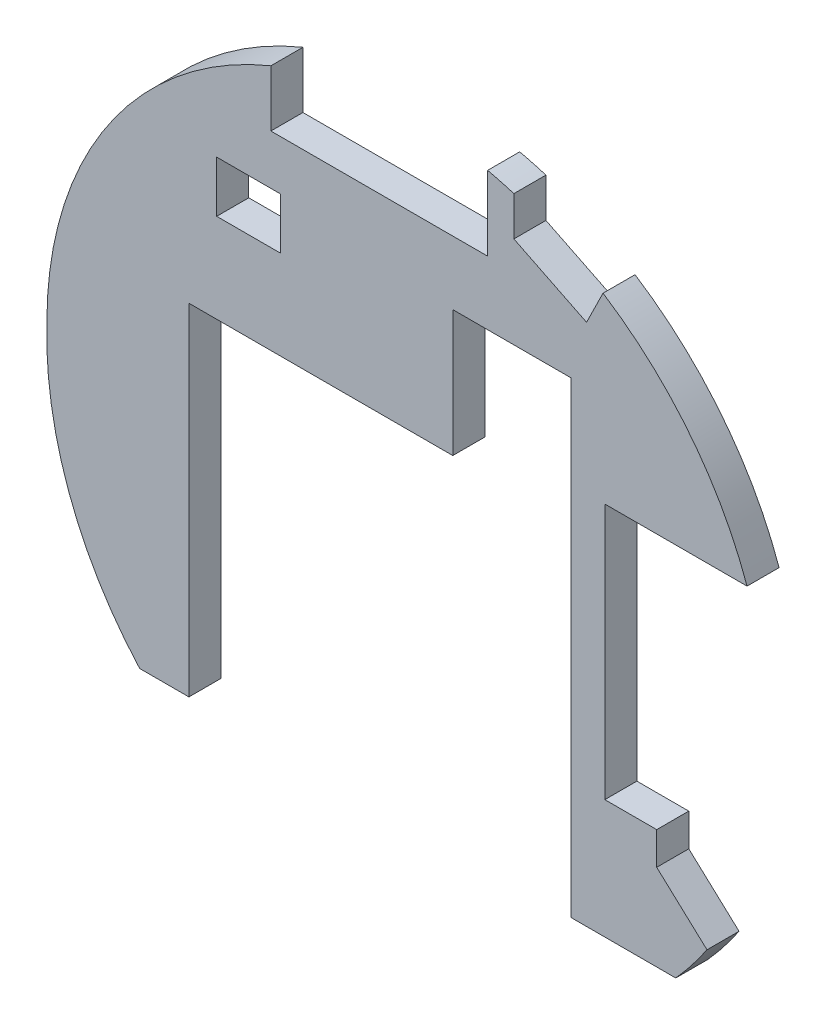
ISO-10303-21;
HEADER;
FILE_DESCRIPTION(('STEP AP214'),'2;1');
FILE_NAME('part.step','',(''),(''),'','','');
FILE_SCHEMA(('AUTOMOTIVE_DESIGN { 1 0 10303 214 1 1 1 1 }'));
ENDSEC;
DATA;
#1=APPLICATION_CONTEXT('core data for automotive mechanical design processes');
#2=APPLICATION_PROTOCOL_DEFINITION('international standard','automotive_design',2000,#1);
#3=PRODUCT_CONTEXT('',#1,'mechanical');
#4=PRODUCT('Part','Part','',(#3));
#5=PRODUCT_RELATED_PRODUCT_CATEGORY('part','',(#4));
#6=PRODUCT_DEFINITION_FORMATION('','',#4);
#7=PRODUCT_DEFINITION_CONTEXT('part definition',#1,'design');
#8=PRODUCT_DEFINITION('design','',#6,#7);
#9=PRODUCT_DEFINITION_SHAPE('','',#8);
#10=(LENGTH_UNIT() NAMED_UNIT(*) SI_UNIT(.MILLI.,.METRE.));
#11=(NAMED_UNIT(*) PLANE_ANGLE_UNIT() SI_UNIT($,.RADIAN.));
#12=(NAMED_UNIT(*) SI_UNIT($,.STERADIAN.) SOLID_ANGLE_UNIT());
#13=UNCERTAINTY_MEASURE_WITH_UNIT(LENGTH_MEASURE(1.E-05),#10,'distance_accuracy_value','');
#14=(GEOMETRIC_REPRESENTATION_CONTEXT(3) GLOBAL_UNCERTAINTY_ASSIGNED_CONTEXT((#13)) GLOBAL_UNIT_ASSIGNED_CONTEXT((#10,
#11,#12)) REPRESENTATION_CONTEXT('',''));
#15=CARTESIAN_POINT('',(0.,0.,0.));
#16=DIRECTION('',(0.,0.,1.));
#17=DIRECTION('',(1.,0.,0.));
#18=AXIS2_PLACEMENT_3D('',#15,#16,#17);
#19=CARTESIAN_POINT('',(-30.8292528479007,-0.03,-1.6));
#20=DIRECTION('',(0.,0.,1.));
#21=DIRECTION('',(1.,0.,0.));
#22=AXIS2_PLACEMENT_3D('',#19,#20,#21);
#23=PLANE('',#22);
#24=DIRECTION('',(0.,-1.,0.));
#25=VECTOR('',#24,1.);
#26=CARTESIAN_POINT('',(-18.815,22.72,-1.6));
#27=LINE('',#26,#25);
#28=CARTESIAN_POINT('',(-18.815,24.,-1.6));
#29=VERTEX_POINT('',#28);
#30=CARTESIAN_POINT('',(-18.815,21.44,-1.6));
#31=VERTEX_POINT('',#30);
#32=EDGE_CURVE('E439',#29,#31,#27,.T.);
#33=ORIENTED_EDGE('',*,*,#32,.F.);
#34=DIRECTION('',(1.,0.,0.));
#35=VECTOR('',#34,1.);
#36=CARTESIAN_POINT('',(-20.405,24.,-1.6));
#37=LINE('',#36,#35);
#38=CARTESIAN_POINT('',(-21.995,24.,-1.6));
#39=VERTEX_POINT('',#38);
#40=EDGE_CURVE('E444',#39,#29,#37,.T.);
#41=ORIENTED_EDGE('',*,*,#40,.F.);
#42=DIRECTION('',(0.,1.,0.));
#43=VECTOR('',#42,1.);
#44=CARTESIAN_POINT('',(-21.995,22.72,-1.6));
#45=LINE('',#44,#43);
#46=CARTESIAN_POINT('',(-21.995,21.44,-1.6));
#47=VERTEX_POINT('',#46);
#48=EDGE_CURVE('E449',#47,#39,#45,.T.);
#49=ORIENTED_EDGE('',*,*,#48,.F.);
#50=DIRECTION('',(-1.,0.,0.));
#51=VECTOR('',#50,1.);
#52=CARTESIAN_POINT('',(-20.405,21.44,-1.6));
#53=LINE('',#52,#51);
#54=EDGE_CURVE('E435',#31,#47,#53,.T.);
#55=ORIENTED_EDGE('',*,*,#54,.F.);
#56=EDGE_LOOP('',(#33,#41,#49,#55));
#57=FACE_BOUND('',#56,.T.);
#58=DIRECTION('',(0.,1.,0.));
#59=VECTOR('',#58,1.);
#60=CARTESIAN_POINT('',(-10.21,20.145,-1.6));
#61=LINE('',#60,#59);
#62=CARTESIAN_POINT('',(-10.21,16.99,-1.6));
#63=VERTEX_POINT('',#62);
#64=CARTESIAN_POINT('',(-10.21,23.3,-1.6));
#65=VERTEX_POINT('',#64);
#66=EDGE_CURVE('E243',#63,#65,#61,.T.);
#67=ORIENTED_EDGE('',*,*,#66,.F.);
#68=DIRECTION('',(1.,0.,0.));
#69=VECTOR('',#68,1.);
#70=CARTESIAN_POINT('',(-16.795,16.99,-1.6));
#71=LINE('',#70,#69);
#72=CARTESIAN_POINT('',(-23.38,16.99,-1.6));
#73=VERTEX_POINT('',#72);
#74=EDGE_CURVE('E332',#73,#63,#71,.T.);
#75=ORIENTED_EDGE('',*,*,#74,.F.);
#76=DIRECTION('',(1.63924794340962E-05,0.999999999865643,0.));
#77=VECTOR('',#76,1.);
#78=CARTESIAN_POINT('',(-23.3801395,8.48,-1.6));
#79=LINE('',#78,#77);
#80=CARTESIAN_POINT('',(-23.380279,-0.0300000000000002,-1.6));
#81=VERTEX_POINT('',#80);
#82=EDGE_CURVE('E267',#81,#73,#79,.T.);
#83=ORIENTED_EDGE('',*,*,#82,.F.);
#84=DIRECTION('',(1.,0.,0.));
#85=VECTOR('',#84,1.);
#86=CARTESIAN_POINT('',(-24.6101395,-0.03,-1.6));
#87=LINE('',#86,#85);
#88=CARTESIAN_POINT('',(-25.8399999999612,-0.0300000000000003,-1.6));
#89=VERTEX_POINT('',#88);
#90=EDGE_CURVE('E261',#89,#81,#87,.T.);
#91=ORIENTED_EDGE('',*,*,#90,.F.);
#92=CARTESIAN_POINT('',(-12.4345083212483,12.0497416317025,-1.6));
#93=DIRECTION('',(0.,0.,1.));
#94=DIRECTION('',(1.,0.,0.));
#95=AXIS2_PLACEMENT_3D('',#92,#93,#94);
#96=CIRCLE('',#95,18.045147963807);
#97=CARTESIAN_POINT('',(-30.4699999999998,12.640000000014,-1.6));
#98=VERTEX_POINT('',#97);
#99=EDGE_CURVE('E366',#98,#89,#96,.T.);
#100=ORIENTED_EDGE('',*,*,#99,.F.);
#101=CARTESIAN_POINT('',(-12.4797937548539,12.648613095999,-1.6));
#102=DIRECTION('',(0.,0.,1.));
#103=DIRECTION('',(1.,0.,0.));
#104=AXIS2_PLACEMENT_3D('',#101,#102,#103);
#105=CIRCLE('',#104,17.9902083069736);
#106=CARTESIAN_POINT('',(-19.29,29.3000000000041,-1.6));
#107=VERTEX_POINT('',#106);
#108=EDGE_CURVE('E369',#107,#98,#105,.T.);
#109=ORIENTED_EDGE('',*,*,#108,.F.);
#110=DIRECTION('',(0.,1.,0.));
#111=VECTOR('',#110,1.);
#112=CARTESIAN_POINT('',(-19.29,27.89,-1.6));
#113=LINE('',#112,#111);
#114=CARTESIAN_POINT('',(-19.29,26.48,-1.6));
#115=VERTEX_POINT('',#114);
#116=EDGE_CURVE('E272',#115,#107,#113,.T.);
#117=ORIENTED_EDGE('',*,*,#116,.F.);
#118=DIRECTION('',(1.,0.,0.));
#119=VECTOR('',#118,1.);
#120=CARTESIAN_POINT('',(-13.88,26.48,-1.6));
#121=LINE('',#120,#119);
#122=CARTESIAN_POINT('',(-8.47,26.48,-1.6));
#123=VERTEX_POINT('',#122);
#124=EDGE_CURVE('E278',#115,#123,#121,.T.);
#125=ORIENTED_EDGE('',*,*,#124,.T.);
#126=DIRECTION('',(0.,1.,0.));
#127=VECTOR('',#126,1.);
#128=CARTESIAN_POINT('',(-8.47,28.335,-1.6));
#129=LINE('',#128,#127);
#130=CARTESIAN_POINT('',(-8.47,30.1900000000134,-1.59999999999993));
#131=VERTEX_POINT('',#130);
#132=EDGE_CURVE('E284',#123,#131,#129,.T.);
#133=ORIENTED_EDGE('',*,*,#132,.T.);
#134=CARTESIAN_POINT('',(-12.5265605618434,12.3803018970916,-1.59999999999984));
#135=DIRECTION('',(0.,0.,1.));
#136=DIRECTION('',(0.,-1.,0.));
#137=AXIS2_PLACEMENT_3D('',#134,#135,#136);
#138=CIRCLE('',#137,18.2658432630305);
#139=CARTESIAN_POINT('',(-7.159999999996,29.8400000000262,-1.59999999999993));
#140=VERTEX_POINT('',#139);
#141=EDGE_CURVE('E286',#140,#131,#138,.T.);
#142=ORIENTED_EDGE('',*,*,#141,.F.);
#143=DIRECTION('',(0.,1.,0.));
#144=VECTOR('',#143,1.);
#145=CARTESIAN_POINT('',(-7.16,28.86,-1.6));
#146=LINE('',#145,#144);
#147=CARTESIAN_POINT('',(-7.16,27.88,-1.6));
#148=VERTEX_POINT('',#147);
#149=EDGE_CURVE('E289',#148,#140,#146,.T.);
#150=ORIENTED_EDGE('',*,*,#149,.F.);
#151=DIRECTION('',(0.896781672561533,-0.442473311915803,0.));
#152=VECTOR('',#151,1.);
#153=CARTESIAN_POINT('',(-5.3460610000005,26.9849999999995,-1.6));
#154=LINE('',#153,#152);
#155=CARTESIAN_POINT('',(-3.53212200000113,26.0899999999991,-1.6));
#156=VERTEX_POINT('',#155);
#157=EDGE_CURVE('E295',#148,#156,#154,.T.);
#158=ORIENTED_EDGE('',*,*,#157,.T.);
#159=DIRECTION('',(-0.441670253964057,-0.897177455559002,0.));
#160=VECTOR('',#159,1.);
#161=CARTESIAN_POINT('',(-3.1210610000005,26.925,-1.6));
#162=LINE('',#161,#160);
#163=CARTESIAN_POINT('',(-2.70999999998666,27.7600000000271,-1.6));
#164=VERTEX_POINT('',#163);
#165=EDGE_CURVE('E298',#164,#156,#162,.T.);
#166=ORIENTED_EDGE('',*,*,#165,.F.);
#167=CARTESIAN_POINT('',(-12.4642751313569,12.642719052501,-1.6));
#168=DIRECTION('',(0.,0.,1.));
#169=DIRECTION('',(1.,0.,0.));
#170=AXIS2_PLACEMENT_3D('',#167,#168,#169);
#171=CIRCLE('',#170,17.9910551826729);
#172=CARTESIAN_POINT('',(4.48000000002448,18.690000000004,-1.6));
#173=VERTEX_POINT('',#172);
#174=EDGE_CURVE('E372',#173,#164,#171,.T.);
#175=ORIENTED_EDGE('',*,*,#174,.F.);
#176=DIRECTION('',(1.,0.,0.));
#177=VECTOR('',#176,1.);
#178=CARTESIAN_POINT('',(0.93,18.69,-1.6));
#179=LINE('',#178,#177);
#180=CARTESIAN_POINT('',(-2.62,18.69,-1.6));
#181=VERTEX_POINT('',#180);
#182=EDGE_CURVE('E306',#181,#173,#179,.T.);
#183=ORIENTED_EDGE('',*,*,#182,.F.);
#184=DIRECTION('',(0.,1.,0.));
#185=VECTOR('',#184,1.);
#186=CARTESIAN_POINT('',(-2.62,12.3,-1.6));
#187=LINE('',#186,#185);
#188=CARTESIAN_POINT('',(-2.62,5.91,-1.6));
#189=VERTEX_POINT('',#188);
#190=EDGE_CURVE('E312',#189,#181,#187,.T.);
#191=ORIENTED_EDGE('',*,*,#190,.F.);
#192=DIRECTION('',(1.,0.,0.));
#193=VECTOR('',#192,1.);
#194=CARTESIAN_POINT('',(-1.325,5.91,-1.6));
#195=LINE('',#194,#193);
#196=CARTESIAN_POINT('',(-0.03,5.91,-1.6));
#197=VERTEX_POINT('',#196);
#198=EDGE_CURVE('E317',#189,#197,#195,.T.);
#199=ORIENTED_EDGE('',*,*,#198,.T.);
#200=DIRECTION('',(0.,1.,0.));
#201=VECTOR('',#200,1.);
#202=CARTESIAN_POINT('',(-0.03,5.095,-1.6));
#203=LINE('',#202,#201);
#204=CARTESIAN_POINT('',(-0.03,4.28,-1.6));
#205=VERTEX_POINT('',#204);
#206=EDGE_CURVE('E204',#205,#197,#203,.T.);
#207=ORIENTED_EDGE('',*,*,#206,.F.);
#208=DIRECTION('',(0.735814146033704,-0.67718353678799,0.));
#209=VECTOR('',#208,1.);
#210=CARTESIAN_POINT('',(1.225,3.125,-1.6));
#211=LINE('',#210,#209);
#212=CARTESIAN_POINT('',(2.47999999999056,1.97000000000869,-1.6));
#213=VERTEX_POINT('',#212);
#214=EDGE_CURVE('E199',#205,#213,#211,.T.);
#215=ORIENTED_EDGE('',*,*,#214,.T.);
#216=CARTESIAN_POINT('',(-12.3596179193643,11.9365019771437,-1.6));
#217=DIRECTION('',(0.,0.,1.));
#218=DIRECTION('',(1.,0.,0.));
#219=AXIS2_PLACEMENT_3D('',#216,#217,#218);
#220=CIRCLE('',#219,17.8758334533587);
#221=CARTESIAN_POINT('',(0.919999999968946,-0.0299999999899556,-1.6));
#222=VERTEX_POINT('',#221);
#223=EDGE_CURVE('E21',#222,#213,#220,.T.);
#224=ORIENTED_EDGE('',*,*,#223,.F.);
#225=DIRECTION('',(1.,0.,0.));
#226=VECTOR('',#225,1.);
#227=CARTESIAN_POINT('',(-1.695,-0.03,-1.6));
#228=LINE('',#227,#226);
#229=CARTESIAN_POINT('',(-4.31,-0.0300000000000002,-1.6));
#230=VERTEX_POINT('',#229);
#231=EDGE_CURVE('E194',#230,#222,#228,.T.);
#232=ORIENTED_EDGE('',*,*,#231,.F.);
#233=DIRECTION('',(0.,1.,0.));
#234=VECTOR('',#233,1.);
#235=CARTESIAN_POINT('',(-4.31,11.635,-1.6));
#236=LINE('',#235,#234);
#237=CARTESIAN_POINT('',(-4.31,23.3,-1.6));
#238=VERTEX_POINT('',#237);
#239=EDGE_CURVE('E228',#230,#238,#236,.T.);
#240=ORIENTED_EDGE('',*,*,#239,.T.);
#241=DIRECTION('',(-1.,0.,0.));
#242=VECTOR('',#241,1.);
#243=CARTESIAN_POINT('',(-7.26,23.3,-1.6));
#244=LINE('',#243,#242);
#245=EDGE_CURVE('E242',#238,#65,#244,.T.);
#246=ORIENTED_EDGE('',*,*,#245,.T.);
#247=EDGE_LOOP('',(#67,#75,#83,#91,#100,#109,#117,#125,#133,#142,#150,#158,#166,#175,#183,#191,
#199,#207,#215,#224,#232,#240,#246));
#248=FACE_BOUND('',#247,.T.);
#249=ADVANCED_FACE('F17',(#57,#248),#23,.F.);
#250=CARTESIAN_POINT('',(-4.31,-0.03,-1.6));
#251=DIRECTION('',(1.,0.,0.));
#252=DIRECTION('',(0.,1.,0.));
#253=AXIS2_PLACEMENT_3D('',#250,#251,#252);
#254=PLANE('',#253);
#255=DIRECTION('',(0.,0.,-1.));
#256=VECTOR('',#255,1.);
#257=CARTESIAN_POINT('',(-4.31,23.3,-0.8));
#258=LINE('',#257,#256);
#259=CARTESIAN_POINT('',(-4.31,23.3,0.));
#260=VERTEX_POINT('',#259);
#261=EDGE_CURVE('E239',#260,#238,#258,.T.);
#262=ORIENTED_EDGE('',*,*,#261,.T.);
#263=ORIENTED_EDGE('',*,*,#239,.F.);
#264=DIRECTION('',(0.,0.,-1.));
#265=VECTOR('',#264,1.);
#266=CARTESIAN_POINT('',(-4.31,-0.03,-0.8));
#267=LINE('',#266,#265);
#268=CARTESIAN_POINT('',(-4.31,-0.0300000000000003,0.));
#269=VERTEX_POINT('',#268);
#270=EDGE_CURVE('E226',#269,#230,#267,.T.);
#271=ORIENTED_EDGE('',*,*,#270,.F.);
#272=DIRECTION('',(0.,-1.,0.));
#273=VECTOR('',#272,1.);
#274=CARTESIAN_POINT('',(-4.31,15.0800000000135,0.));
#275=LINE('',#274,#273);
#276=EDGE_CURVE('E231',#260,#269,#275,.T.);
#277=ORIENTED_EDGE('',*,*,#276,.F.);
#278=EDGE_LOOP('',(#262,#263,#271,#277));
#279=FACE_BOUND('',#278,.T.);
#280=ADVANCED_FACE('F770',(#279),#254,.F.);
#281=CARTESIAN_POINT('',(-4.31,-0.03,-1.6));
#282=DIRECTION('',(0.,-1.,0.));
#283=DIRECTION('',(1.,0.,0.));
#284=AXIS2_PLACEMENT_3D('',#281,#282,#283);
#285=PLANE('',#284);
#286=DIRECTION('',(0.,0.,-1.));
#287=VECTOR('',#286,1.);
#288=CARTESIAN_POINT('',(0.919999999978,-0.02999999997991,-0.8));
#289=LINE('',#288,#287);
#290=CARTESIAN_POINT('',(0.919999999968946,-0.0299999999899556,0.));
#291=VERTEX_POINT('',#290);
#292=EDGE_CURVE('E214',#291,#222,#289,.T.);
#293=ORIENTED_EDGE('',*,*,#292,.F.);
#294=DIRECTION('',(1.,0.,0.));
#295=VECTOR('',#294,1.);
#296=CARTESIAN_POINT('',(-13.1746264239389,-0.03,0.));
#297=LINE('',#296,#295);
#298=EDGE_CURVE('E235',#269,#291,#297,.T.);
#299=ORIENTED_EDGE('',*,*,#298,.F.);
#300=ORIENTED_EDGE('',*,*,#270,.T.);
#301=ORIENTED_EDGE('',*,*,#231,.T.);
#302=EDGE_LOOP('',(#293,#299,#300,#301));
#303=FACE_BOUND('',#302,.T.);
#304=ADVANCED_FACE('F761',(#303),#285,.T.);
#305=CARTESIAN_POINT('',(-12.3596179193643,11.9365019771437,-1.6));
#306=DIRECTION('',(0.,0.,1.));
#307=DIRECTION('',(1.,0.,0.));
#308=AXIS2_PLACEMENT_3D('',#305,#306,#307);
#309=CYLINDRICAL_SURFACE('',#308,17.8758334533587);
#310=ORIENTED_EDGE('',*,*,#223,.T.);
#311=DIRECTION('',(0.,0.,1.));
#312=VECTOR('',#311,1.);
#313=CARTESIAN_POINT('',(2.48,1.97,-0.8));
#314=LINE('',#313,#312);
#315=CARTESIAN_POINT('',(2.47999999999055,1.97000000000869,0.));
#316=VERTEX_POINT('',#315);
#317=EDGE_CURVE('E208',#213,#316,#314,.T.);
#318=ORIENTED_EDGE('',*,*,#317,.T.);
#319=CARTESIAN_POINT('',(-12.3596179193643,11.9365019771437,0.));
#320=DIRECTION('',(0.,0.,1.));
#321=DIRECTION('',(1.,0.,0.));
#322=AXIS2_PLACEMENT_3D('',#319,#320,#321);
#323=CIRCLE('',#322,17.8758334533587);
#324=EDGE_CURVE('E364',#291,#316,#323,.T.);
#325=ORIENTED_EDGE('',*,*,#324,.F.);
#326=ORIENTED_EDGE('',*,*,#292,.T.);
#327=EDGE_LOOP('',(#310,#318,#325,#326));
#328=FACE_BOUND('',#327,.T.);
#329=ADVANCED_FACE('F211',(#328),#309,.T.);
#330=CARTESIAN_POINT('',(-0.03,4.28,-1.6));
#331=DIRECTION('',(-0.67718353678799,-0.735814146033704,0.));
#332=DIRECTION('',(0.735814146033704,-0.67718353678799,0.));
#333=AXIS2_PLACEMENT_3D('',#330,#331,#332);
#334=PLANE('',#333);
#335=ORIENTED_EDGE('',*,*,#317,.F.);
#336=ORIENTED_EDGE('',*,*,#214,.F.);
#337=DIRECTION('',(0.,0.,-1.));
#338=VECTOR('',#337,1.);
#339=CARTESIAN_POINT('',(-0.03,4.28,-0.8));
#340=LINE('',#339,#338);
#341=CARTESIAN_POINT('',(-0.0299999999999985,4.28,0.));
#342=VERTEX_POINT('',#341);
#343=EDGE_CURVE('E219',#342,#205,#340,.T.);
#344=ORIENTED_EDGE('',*,*,#343,.F.);
#345=DIRECTION('',(-0.735814146033703,0.677183536787991,0.));
#346=VECTOR('',#345,1.);
#347=CARTESIAN_POINT('',(2.48,1.97,0.));
#348=LINE('',#347,#346);
#349=EDGE_CURVE('E217',#316,#342,#348,.T.);
#350=ORIENTED_EDGE('',*,*,#349,.F.);
#351=EDGE_LOOP('',(#335,#336,#344,#350));
#352=FACE_BOUND('',#351,.T.);
#353=ADVANCED_FACE('F215',(#352),#334,.F.);
#354=CARTESIAN_POINT('',(-0.03,4.28,-1.6));
#355=DIRECTION('',(1.,0.,0.));
#356=DIRECTION('',(0.,1.,0.));
#357=AXIS2_PLACEMENT_3D('',#354,#355,#356);
#358=PLANE('',#357);
#359=DIRECTION('',(0.,0.,1.));
#360=VECTOR('',#359,1.);
#361=CARTESIAN_POINT('',(-0.03,5.91,-0.8));
#362=LINE('',#361,#360);
#363=CARTESIAN_POINT('',(-0.029999999999999,5.91,0.));
#364=VERTEX_POINT('',#363);
#365=EDGE_CURVE('E319',#197,#364,#362,.T.);
#366=ORIENTED_EDGE('',*,*,#365,.T.);
#367=DIRECTION('',(0.,1.,0.));
#368=VECTOR('',#367,1.);
#369=CARTESIAN_POINT('',(-0.0299999999999983,15.0800000000135,0.));
#370=LINE('',#369,#368);
#371=EDGE_CURVE('E363',#342,#364,#370,.T.);
#372=ORIENTED_EDGE('',*,*,#371,.F.);
#373=ORIENTED_EDGE('',*,*,#343,.T.);
#374=ORIENTED_EDGE('',*,*,#206,.T.);
#375=EDGE_LOOP('',(#366,#372,#373,#374));
#376=FACE_BOUND('',#375,.T.);
#377=ADVANCED_FACE('F412',(#376),#358,.T.);
#378=CARTESIAN_POINT('',(-2.62,5.91,-1.6));
#379=DIRECTION('',(0.,-1.,0.));
#380=DIRECTION('',(1.,0.,0.));
#381=AXIS2_PLACEMENT_3D('',#378,#379,#380);
#382=PLANE('',#381);
#383=ORIENTED_EDGE('',*,*,#365,.F.);
#384=ORIENTED_EDGE('',*,*,#198,.F.);
#385=DIRECTION('',(0.,0.,-1.));
#386=VECTOR('',#385,1.);
#387=CARTESIAN_POINT('',(-2.62,5.91,-0.8));
#388=LINE('',#387,#386);
#389=CARTESIAN_POINT('',(-2.62,5.91,0.));
#390=VERTEX_POINT('',#389);
#391=EDGE_CURVE('E314',#390,#189,#388,.T.);
#392=ORIENTED_EDGE('',*,*,#391,.F.);
#393=DIRECTION('',(-1.,0.,0.));
#394=VECTOR('',#393,1.);
#395=CARTESIAN_POINT('',(-13.1746264239389,5.91,0.));
#396=LINE('',#395,#394);
#397=EDGE_CURVE('E390',#364,#390,#396,.T.);
#398=ORIENTED_EDGE('',*,*,#397,.F.);
#399=EDGE_LOOP('',(#383,#384,#392,#398));
#400=FACE_BOUND('',#399,.T.);
#401=ADVANCED_FACE('F415',(#400),#382,.F.);
#402=CARTESIAN_POINT('',(-2.62,5.91,-1.6));
#403=DIRECTION('',(1.,0.,0.));
#404=DIRECTION('',(0.,1.,0.));
#405=AXIS2_PLACEMENT_3D('',#402,#403,#404);
#406=PLANE('',#405);
#407=DIRECTION('',(0.,0.,-1.));
#408=VECTOR('',#407,1.);
#409=CARTESIAN_POINT('',(-2.62,18.69,-0.8));
#410=LINE('',#409,#408);
#411=CARTESIAN_POINT('',(-2.62,18.69,0.));
#412=VERTEX_POINT('',#411);
#413=EDGE_CURVE('E309',#412,#181,#410,.T.);
#414=ORIENTED_EDGE('',*,*,#413,.F.);
#415=DIRECTION('',(0.,1.,0.));
#416=VECTOR('',#415,1.);
#417=CARTESIAN_POINT('',(-2.62,15.0800000000135,0.));
#418=LINE('',#417,#416);
#419=EDGE_CURVE('E387',#390,#412,#418,.T.);
#420=ORIENTED_EDGE('',*,*,#419,.F.);
#421=ORIENTED_EDGE('',*,*,#391,.T.);
#422=ORIENTED_EDGE('',*,*,#190,.T.);
#423=EDGE_LOOP('',(#414,#420,#421,#422));
#424=FACE_BOUND('',#423,.T.);
#425=ADVANCED_FACE('F419',(#424),#406,.T.);
#426=CARTESIAN_POINT('',(-2.62,18.69,-1.6));
#427=DIRECTION('',(0.,-1.,0.));
#428=DIRECTION('',(1.,0.,0.));
#429=AXIS2_PLACEMENT_3D('',#426,#427,#428);
#430=PLANE('',#429);
#431=DIRECTION('',(0.,0.,-1.));
#432=VECTOR('',#431,1.);
#433=CARTESIAN_POINT('',(4.480000000023,18.690000000008,-0.8));
#434=LINE('',#433,#432);
#435=CARTESIAN_POINT('',(4.48000000002448,18.690000000004,0.));
#436=VERTEX_POINT('',#435);
#437=EDGE_CURVE('E308',#436,#173,#434,.T.);
#438=ORIENTED_EDGE('',*,*,#437,.F.);
#439=DIRECTION('',(1.,0.,0.));
#440=VECTOR('',#439,1.);
#441=CARTESIAN_POINT('',(-13.1746264239389,18.69,0.));
#442=LINE('',#441,#440);
#443=EDGE_CURVE('E361',#412,#436,#442,.T.);
#444=ORIENTED_EDGE('',*,*,#443,.F.);
#445=ORIENTED_EDGE('',*,*,#413,.T.);
#446=ORIENTED_EDGE('',*,*,#182,.T.);
#447=EDGE_LOOP('',(#438,#444,#445,#446));
#448=FACE_BOUND('',#447,.T.);
#449=ADVANCED_FACE('F712',(#448),#430,.T.);
#450=CARTESIAN_POINT('',(-12.4642751313569,12.642719052501,-1.6));
#451=DIRECTION('',(0.,0.,1.));
#452=DIRECTION('',(1.,0.,0.));
#453=AXIS2_PLACEMENT_3D('',#450,#451,#452);
#454=CYLINDRICAL_SURFACE('',#453,17.9910551826729);
#455=ORIENTED_EDGE('',*,*,#174,.T.);
#456=DIRECTION('',(0.,0.,-1.));
#457=VECTOR('',#456,1.);
#458=CARTESIAN_POINT('',(-2.71,27.76,-0.8));
#459=LINE('',#458,#457);
#460=CARTESIAN_POINT('',(-2.70999999998666,27.7600000000271,0.));
#461=VERTEX_POINT('',#460);
#462=EDGE_CURVE('E303',#461,#164,#459,.T.);
#463=ORIENTED_EDGE('',*,*,#462,.F.);
#464=CARTESIAN_POINT('',(-12.4642751313569,12.642719052501,0.));
#465=DIRECTION('',(0.,0.,1.));
#466=DIRECTION('',(1.,0.,0.));
#467=AXIS2_PLACEMENT_3D('',#464,#465,#466);
#468=CIRCLE('',#467,17.9910551826729);
#469=EDGE_CURVE('E358',#436,#461,#468,.T.);
#470=ORIENTED_EDGE('',*,*,#469,.F.);
#471=ORIENTED_EDGE('',*,*,#437,.T.);
#472=EDGE_LOOP('',(#455,#463,#470,#471));
#473=FACE_BOUND('',#472,.T.);
#474=ADVANCED_FACE('F703',(#473),#454,.T.);
#475=CARTESIAN_POINT('',(-2.71,27.76,-1.6));
#476=DIRECTION('',(-0.897177455559002,0.441670253964057,0.));
#477=DIRECTION('',(-0.441670253964057,-0.897177455559002,0.));
#478=AXIS2_PLACEMENT_3D('',#475,#476,#477);
#479=PLANE('',#478);
#480=DIRECTION('',(0.,0.,1.));
#481=VECTOR('',#480,1.);
#482=CARTESIAN_POINT('',(-3.532122000001,26.089999999999,-0.8));
#483=LINE('',#482,#481);
#484=CARTESIAN_POINT('',(-3.5321220000004,26.0899999999995,0.));
#485=VERTEX_POINT('',#484);
#486=EDGE_CURVE('E297',#156,#485,#483,.T.);
#487=ORIENTED_EDGE('',*,*,#486,.T.);
#488=DIRECTION('',(-0.441670253963623,-0.897177455559216,0.));
#489=VECTOR('',#488,1.);
#490=CARTESIAN_POINT('',(-2.71,27.76,0.));
#491=LINE('',#490,#489);
#492=EDGE_CURVE('E355',#461,#485,#491,.T.);
#493=ORIENTED_EDGE('',*,*,#492,.F.);
#494=ORIENTED_EDGE('',*,*,#462,.T.);
#495=ORIENTED_EDGE('',*,*,#165,.T.);
#496=EDGE_LOOP('',(#487,#493,#494,#495));
#497=FACE_BOUND('',#496,.T.);
#498=ADVANCED_FACE('F492',(#497),#479,.T.);
#499=CARTESIAN_POINT('',(-7.16,27.88,-1.6));
#500=DIRECTION('',(-0.442473311915803,-0.896781672561533,0.));
#501=DIRECTION('',(0.896781672561533,-0.442473311915803,0.));
#502=AXIS2_PLACEMENT_3D('',#499,#500,#501);
#503=PLANE('',#502);
#504=ORIENTED_EDGE('',*,*,#486,.F.);
#505=ORIENTED_EDGE('',*,*,#157,.F.);
#506=DIRECTION('',(0.,0.,-1.));
#507=VECTOR('',#506,1.);
#508=CARTESIAN_POINT('',(-7.16,27.88,-0.8));
#509=LINE('',#508,#507);
#510=CARTESIAN_POINT('',(-7.16,27.88,0.));
#511=VERTEX_POINT('',#510);
#512=EDGE_CURVE('E292',#511,#148,#509,.T.);
#513=ORIENTED_EDGE('',*,*,#512,.F.);
#514=DIRECTION('',(-0.89678167256168,0.442473311915506,0.));
#515=VECTOR('',#514,1.);
#516=CARTESIAN_POINT('',(-3.532122,26.09,0.));
#517=LINE('',#516,#515);
#518=EDGE_CURVE('E352',#485,#511,#517,.T.);
#519=ORIENTED_EDGE('',*,*,#518,.F.);
#520=EDGE_LOOP('',(#504,#505,#513,#519));
#521=FACE_BOUND('',#520,.T.);
#522=ADVANCED_FACE('F494',(#521),#503,.F.);
#523=CARTESIAN_POINT('',(-7.16,27.88,-1.6));
#524=DIRECTION('',(1.,0.,0.));
#525=DIRECTION('',(0.,1.,0.));
#526=AXIS2_PLACEMENT_3D('',#523,#524,#525);
#527=PLANE('',#526);
#528=DIRECTION('',(0.,0.,-1.));
#529=VECTOR('',#528,1.);
#530=CARTESIAN_POINT('',(-7.159999999992,29.840000000025,-0.8));
#531=LINE('',#530,#529);
#532=CARTESIAN_POINT('',(-7.159999999996,29.8400000000262,0.));
#533=VERTEX_POINT('',#532);
#534=EDGE_CURVE('E291',#533,#140,#531,.T.);
#535=ORIENTED_EDGE('',*,*,#534,.F.);
#536=DIRECTION('',(0.,1.,0.));
#537=VECTOR('',#536,1.);
#538=CARTESIAN_POINT('',(-7.16,15.0800000000135,0.));
#539=LINE('',#538,#537);
#540=EDGE_CURVE('E351',#511,#533,#539,.T.);
#541=ORIENTED_EDGE('',*,*,#540,.F.);
#542=ORIENTED_EDGE('',*,*,#512,.T.);
#543=ORIENTED_EDGE('',*,*,#149,.T.);
#544=EDGE_LOOP('',(#535,#541,#542,#543));
#545=FACE_BOUND('',#544,.T.);
#546=ADVANCED_FACE('F500',(#545),#527,.T.);
#547=CARTESIAN_POINT('',(-12.5265605618434,12.3803018970916,-1.59999999999984));
#548=DIRECTION('',(0.,0.,1.));
#549=DIRECTION('',(0.,-1.,0.));
#550=AXIS2_PLACEMENT_3D('',#547,#548,#549);
#551=CYLINDRICAL_SURFACE('',#550,18.2658432630305);
#552=ORIENTED_EDGE('',*,*,#141,.T.);
#553=DIRECTION('',(0.,0.,1.));
#554=VECTOR('',#553,1.);
#555=CARTESIAN_POINT('',(-8.47,30.19,-0.8));
#556=LINE('',#555,#554);
#557=CARTESIAN_POINT('',(-8.47,30.1900000000134,0.));
#558=VERTEX_POINT('',#557);
#559=EDGE_CURVE('E281',#131,#558,#556,.T.);
#560=ORIENTED_EDGE('',*,*,#559,.T.);
#561=CARTESIAN_POINT('',(-12.5265605618434,12.3803018970916,1.57209315010398E-13));
#562=DIRECTION('',(0.,0.,1.));
#563=DIRECTION('',(0.,-1.,0.));
#564=AXIS2_PLACEMENT_3D('',#561,#562,#563);
#565=CIRCLE('',#564,18.2658432630305);
#566=EDGE_CURVE('E347',#533,#558,#565,.T.);
#567=ORIENTED_EDGE('',*,*,#566,.F.);
#568=ORIENTED_EDGE('',*,*,#534,.T.);
#569=EDGE_LOOP('',(#552,#560,#567,#568));
#570=FACE_BOUND('',#569,.T.);
#571=ADVANCED_FACE('F504',(#570),#551,.T.);
#572=CARTESIAN_POINT('',(-8.47,26.48,-1.6));
#573=DIRECTION('',(1.,0.,0.));
#574=DIRECTION('',(0.,1.,0.));
#575=AXIS2_PLACEMENT_3D('',#572,#573,#574);
#576=PLANE('',#575);
#577=ORIENTED_EDGE('',*,*,#559,.F.);
#578=ORIENTED_EDGE('',*,*,#132,.F.);
#579=DIRECTION('',(0.,0.,1.));
#580=VECTOR('',#579,1.);
#581=CARTESIAN_POINT('',(-8.47,26.48,-0.8));
#582=LINE('',#581,#580);
#583=CARTESIAN_POINT('',(-8.47,26.48,0.));
#584=VERTEX_POINT('',#583);
#585=EDGE_CURVE('E280',#123,#584,#582,.T.);
#586=ORIENTED_EDGE('',*,*,#585,.T.);
#587=DIRECTION('',(0.,-1.,0.));
#588=VECTOR('',#587,1.);
#589=CARTESIAN_POINT('',(-8.47,15.0800000000135,0.));
#590=LINE('',#589,#588);
#591=EDGE_CURVE('E350',#558,#584,#590,.T.);
#592=ORIENTED_EDGE('',*,*,#591,.F.);
#593=EDGE_LOOP('',(#577,#578,#586,#592));
#594=FACE_BOUND('',#593,.T.);
#595=ADVANCED_FACE('F509',(#594),#576,.F.);
#596=CARTESIAN_POINT('',(-19.29,26.48,-1.6));
#597=DIRECTION('',(0.,-1.,0.));
#598=DIRECTION('',(1.,0.,0.));
#599=AXIS2_PLACEMENT_3D('',#596,#597,#598);
#600=PLANE('',#599);
#601=ORIENTED_EDGE('',*,*,#585,.F.);
#602=ORIENTED_EDGE('',*,*,#124,.F.);
#603=DIRECTION('',(0.,0.,-1.));
#604=VECTOR('',#603,1.);
#605=CARTESIAN_POINT('',(-19.29,26.48,-0.8));
#606=LINE('',#605,#604);
#607=CARTESIAN_POINT('',(-19.29,26.48,0.));
#608=VERTEX_POINT('',#607);
#609=EDGE_CURVE('E275',#608,#115,#606,.T.);
#610=ORIENTED_EDGE('',*,*,#609,.F.);
#611=DIRECTION('',(-1.,0.,0.));
#612=VECTOR('',#611,1.);
#613=CARTESIAN_POINT('',(-13.1746264239389,26.48,0.));
#614=LINE('',#613,#612);
#615=EDGE_CURVE('E472',#584,#608,#614,.T.);
#616=ORIENTED_EDGE('',*,*,#615,.F.);
#617=EDGE_LOOP('',(#601,#602,#610,#616));
#618=FACE_BOUND('',#617,.T.);
#619=ADVANCED_FACE('F652',(#618),#600,.F.);
#620=CARTESIAN_POINT('',(-19.29,26.48,-1.6));
#621=DIRECTION('',(1.,0.,0.));
#622=DIRECTION('',(0.,1.,0.));
#623=AXIS2_PLACEMENT_3D('',#620,#621,#622);
#624=PLANE('',#623);
#625=DIRECTION('',(0.,0.,-1.));
#626=VECTOR('',#625,1.);
#627=CARTESIAN_POINT('',(-19.29,29.300000000004,-0.8));
#628=LINE('',#627,#626);
#629=CARTESIAN_POINT('',(-19.29,29.3000000000041,0.));
#630=VERTEX_POINT('',#629);
#631=EDGE_CURVE('E274',#630,#107,#628,.T.);
#632=ORIENTED_EDGE('',*,*,#631,.F.);
#633=DIRECTION('',(0.,1.,0.));
#634=VECTOR('',#633,1.);
#635=CARTESIAN_POINT('',(-19.29,15.0800000000135,0.));
#636=LINE('',#635,#634);
#637=EDGE_CURVE('E346',#608,#630,#636,.T.);
#638=ORIENTED_EDGE('',*,*,#637,.F.);
#639=ORIENTED_EDGE('',*,*,#609,.T.);
#640=ORIENTED_EDGE('',*,*,#116,.T.);
#641=EDGE_LOOP('',(#632,#638,#639,#640));
#642=FACE_BOUND('',#641,.T.);
#643=ADVANCED_FACE('F642',(#642),#624,.T.);
#644=CARTESIAN_POINT('',(-12.4797937548539,12.648613095999,-1.6));
#645=DIRECTION('',(0.,0.,1.));
#646=DIRECTION('',(1.,0.,0.));
#647=AXIS2_PLACEMENT_3D('',#644,#645,#646);
#648=CYLINDRICAL_SURFACE('',#647,17.9902083069736);
#649=ORIENTED_EDGE('',*,*,#108,.T.);
#650=DIRECTION('',(0.,0.,-1.));
#651=VECTOR('',#650,1.);
#652=CARTESIAN_POINT('',(-30.47,12.64,-0.8));
#653=LINE('',#652,#651);
#654=CARTESIAN_POINT('',(-30.4699999999998,12.640000000014,0.));
#655=VERTEX_POINT('',#654);
#656=EDGE_CURVE('E368',#655,#98,#653,.T.);
#657=ORIENTED_EDGE('',*,*,#656,.F.);
#658=CARTESIAN_POINT('',(-12.4797937548539,12.648613095999,0.));
#659=DIRECTION('',(0.,0.,1.));
#660=DIRECTION('',(1.,0.,0.));
#661=AXIS2_PLACEMENT_3D('',#658,#659,#660);
#662=CIRCLE('',#661,17.9902083069736);
#663=EDGE_CURVE('E343',#630,#655,#662,.T.);
#664=ORIENTED_EDGE('',*,*,#663,.F.);
#665=ORIENTED_EDGE('',*,*,#631,.T.);
#666=EDGE_LOOP('',(#649,#657,#664,#665));
#667=FACE_BOUND('',#666,.T.);
#668=ADVANCED_FACE('F632',(#667),#648,.T.);
#669=CARTESIAN_POINT('',(-12.4345083212483,12.0497416317025,-1.6));
#670=DIRECTION('',(0.,0.,1.));
#671=DIRECTION('',(1.,0.,0.));
#672=AXIS2_PLACEMENT_3D('',#669,#670,#671);
#673=CYLINDRICAL_SURFACE('',#672,18.045147963807);
#674=ORIENTED_EDGE('',*,*,#99,.T.);
#675=DIRECTION('',(0.,0.,-1.));
#676=VECTOR('',#675,1.);
#677=CARTESIAN_POINT('',(-25.84,-0.03,-0.8));
#678=LINE('',#677,#676);
#679=CARTESIAN_POINT('',(-25.8399999999612,-0.0300000000000003,0.));
#680=VERTEX_POINT('',#679);
#681=EDGE_CURVE('E264',#680,#89,#678,.T.);
#682=ORIENTED_EDGE('',*,*,#681,.F.);
#683=CARTESIAN_POINT('',(-12.4345083212483,12.0497416317025,0.));
#684=DIRECTION('',(0.,0.,1.));
#685=DIRECTION('',(1.,0.,0.));
#686=AXIS2_PLACEMENT_3D('',#683,#684,#685);
#687=CIRCLE('',#686,18.045147963807);
#688=EDGE_CURVE('E340',#655,#680,#687,.T.);
#689=ORIENTED_EDGE('',*,*,#688,.F.);
#690=ORIENTED_EDGE('',*,*,#656,.T.);
#691=EDGE_LOOP('',(#674,#682,#689,#690));
#692=FACE_BOUND('',#691,.T.);
#693=ADVANCED_FACE('F622',(#692),#673,.T.);
#694=CARTESIAN_POINT('',(-25.84,-0.03,-1.6));
#695=DIRECTION('',(0.,-1.,0.));
#696=DIRECTION('',(1.,0.,0.));
#697=AXIS2_PLACEMENT_3D('',#694,#695,#696);
#698=PLANE('',#697);
#699=DIRECTION('',(0.,0.,-1.));
#700=VECTOR('',#699,1.);
#701=CARTESIAN_POINT('',(-23.380279,-0.03,-0.8));
#702=LINE('',#701,#700);
#703=CARTESIAN_POINT('',(-23.380279,-0.03,0.));
#704=VERTEX_POINT('',#703);
#705=EDGE_CURVE('E263',#704,#81,#702,.T.);
#706=ORIENTED_EDGE('',*,*,#705,.F.);
#707=DIRECTION('',(1.,0.,0.));
#708=VECTOR('',#707,1.);
#709=CARTESIAN_POINT('',(-13.1746264239389,-0.03,0.));
#710=LINE('',#709,#708);
#711=EDGE_CURVE('E339',#680,#704,#710,.T.);
#712=ORIENTED_EDGE('',*,*,#711,.F.);
#713=ORIENTED_EDGE('',*,*,#681,.T.);
#714=ORIENTED_EDGE('',*,*,#90,.T.);
#715=EDGE_LOOP('',(#706,#712,#713,#714));
#716=FACE_BOUND('',#715,.T.);
#717=ADVANCED_FACE('F612',(#716),#698,.T.);
#718=CARTESIAN_POINT('',(-23.380279,-0.03,-1.6));
#719=DIRECTION('',(0.999999999865643,-1.63924794340962E-05,0.));
#720=DIRECTION('',(1.63924794340962E-05,0.999999999865643,0.));
#721=AXIS2_PLACEMENT_3D('',#718,#719,#720);
#722=PLANE('',#721);
#723=DIRECTION('',(0.,0.,-1.));
#724=VECTOR('',#723,1.);
#725=CARTESIAN_POINT('',(-23.38,16.99,-0.8));
#726=LINE('',#725,#724);
#727=CARTESIAN_POINT('',(-23.38,16.99,0.));
#728=VERTEX_POINT('',#727);
#729=EDGE_CURVE('E269',#728,#73,#726,.T.);
#730=ORIENTED_EDGE('',*,*,#729,.F.);
#731=DIRECTION('',(1.63924794340962E-05,0.999999999865643,0.));
#732=VECTOR('',#731,1.);
#733=CARTESIAN_POINT('',(-23.380279,-0.03,0.));
#734=LINE('',#733,#732);
#735=EDGE_CURVE('E336',#704,#728,#734,.T.);
#736=ORIENTED_EDGE('',*,*,#735,.F.);
#737=ORIENTED_EDGE('',*,*,#705,.T.);
#738=ORIENTED_EDGE('',*,*,#82,.T.);
#739=EDGE_LOOP('',(#730,#736,#737,#738));
#740=FACE_BOUND('',#739,.T.);
#741=ADVANCED_FACE('F602',(#740),#722,.T.);
#742=CARTESIAN_POINT('',(-23.38,16.99,-1.6));
#743=DIRECTION('',(0.,-1.,0.));
#744=DIRECTION('',(1.,0.,0.));
#745=AXIS2_PLACEMENT_3D('',#742,#743,#744);
#746=PLANE('',#745);
#747=DIRECTION('',(0.,0.,-1.));
#748=VECTOR('',#747,1.);
#749=CARTESIAN_POINT('',(-10.21,16.99,-0.8));
#750=LINE('',#749,#748);
#751=CARTESIAN_POINT('',(-10.21,16.99,0.));
#752=VERTEX_POINT('',#751);
#753=EDGE_CURVE('E454',#752,#63,#750,.T.);
#754=ORIENTED_EDGE('',*,*,#753,.F.);
#755=DIRECTION('',(1.,0.,0.));
#756=VECTOR('',#755,1.);
#757=CARTESIAN_POINT('',(-13.1746264239389,16.99,0.));
#758=LINE('',#757,#756);
#759=EDGE_CURVE('E333',#728,#752,#758,.T.);
#760=ORIENTED_EDGE('',*,*,#759,.F.);
#761=ORIENTED_EDGE('',*,*,#729,.T.);
#762=ORIENTED_EDGE('',*,*,#74,.T.);
#763=EDGE_LOOP('',(#754,#760,#761,#762));
#764=FACE_BOUND('',#763,.T.);
#765=ADVANCED_FACE('F592',(#764),#746,.T.);
#766=CARTESIAN_POINT('',(-10.21,16.99,-1.6));
#767=DIRECTION('',(1.,0.,0.));
#768=DIRECTION('',(0.,1.,0.));
#769=AXIS2_PLACEMENT_3D('',#766,#767,#768);
#770=PLANE('',#769);
#771=DIRECTION('',(0.,0.,1.));
#772=VECTOR('',#771,1.);
#773=CARTESIAN_POINT('',(-10.21,23.3,-0.8));
#774=LINE('',#773,#772);
#775=CARTESIAN_POINT('',(-10.21,23.3,0.));
#776=VERTEX_POINT('',#775);
#777=EDGE_CURVE('E258',#65,#776,#774,.T.);
#778=ORIENTED_EDGE('',*,*,#777,.T.);
#779=DIRECTION('',(0.,1.,0.));
#780=VECTOR('',#779,1.);
#781=CARTESIAN_POINT('',(-10.21,15.0800000000135,0.));
#782=LINE('',#781,#780);
#783=EDGE_CURVE('E250',#752,#776,#782,.T.);
#784=ORIENTED_EDGE('',*,*,#783,.F.);
#785=ORIENTED_EDGE('',*,*,#753,.T.);
#786=ORIENTED_EDGE('',*,*,#66,.T.);
#787=EDGE_LOOP('',(#778,#784,#785,#786));
#788=FACE_BOUND('',#787,.T.);
#789=ADVANCED_FACE('F551',(#788),#770,.T.);
#790=CARTESIAN_POINT('',(-4.31,23.3,-1.6));
#791=DIRECTION('',(0.,1.,0.));
#792=DIRECTION('',(-1.,0.,0.));
#793=AXIS2_PLACEMENT_3D('',#790,#791,#792);
#794=PLANE('',#793);
#795=ORIENTED_EDGE('',*,*,#777,.F.);
#796=ORIENTED_EDGE('',*,*,#245,.F.);
#797=ORIENTED_EDGE('',*,*,#261,.F.);
#798=DIRECTION('',(1.,0.,0.));
#799=VECTOR('',#798,1.);
#800=CARTESIAN_POINT('',(-13.1746264239389,23.3,0.));
#801=LINE('',#800,#799);
#802=EDGE_CURVE('E246',#776,#260,#801,.T.);
#803=ORIENTED_EDGE('',*,*,#802,.F.);
#804=EDGE_LOOP('',(#795,#796,#797,#803));
#805=FACE_BOUND('',#804,.T.);
#806=ADVANCED_FACE('F543',(#805),#794,.F.);
#807=CARTESIAN_POINT('',(-21.995,21.44,-1.6));
#808=DIRECTION('',(1.,0.,0.));
#809=DIRECTION('',(0.,1.,0.));
#810=AXIS2_PLACEMENT_3D('',#807,#808,#809);
#811=PLANE('',#810);
#812=DIRECTION('',(0.,0.,-1.));
#813=VECTOR('',#812,1.);
#814=CARTESIAN_POINT('',(-21.995,24.,-0.8));
#815=LINE('',#814,#813);
#816=CARTESIAN_POINT('',(-21.995,24.,0.));
#817=VERTEX_POINT('',#816);
#818=EDGE_CURVE('E446',#817,#39,#815,.T.);
#819=ORIENTED_EDGE('',*,*,#818,.F.);
#820=DIRECTION('',(0.,1.,0.));
#821=VECTOR('',#820,1.);
#822=CARTESIAN_POINT('',(-21.995,15.0800000000135,0.));
#823=LINE('',#822,#821);
#824=CARTESIAN_POINT('',(-21.995,21.44,0.));
#825=VERTEX_POINT('',#824);
#826=EDGE_CURVE('E249',#825,#817,#823,.T.);
#827=ORIENTED_EDGE('',*,*,#826,.F.);
#828=DIRECTION('',(0.,0.,1.));
#829=VECTOR('',#828,1.);
#830=CARTESIAN_POINT('',(-21.995,21.44,-0.8));
#831=LINE('',#830,#829);
#832=EDGE_CURVE('E236',#47,#825,#831,.T.);
#833=ORIENTED_EDGE('',*,*,#832,.F.);
#834=ORIENTED_EDGE('',*,*,#48,.T.);
#835=EDGE_LOOP('',(#819,#827,#833,#834));
#836=FACE_BOUND('',#835,.T.);
#837=ADVANCED_FACE('F541',(#836),#811,.T.);
#838=CARTESIAN_POINT('',(-21.995,24.,-1.6));
#839=DIRECTION('',(0.,-1.,0.));
#840=DIRECTION('',(1.,0.,0.));
#841=AXIS2_PLACEMENT_3D('',#838,#839,#840);
#842=PLANE('',#841);
#843=DIRECTION('',(0.,0.,-1.));
#844=VECTOR('',#843,1.);
#845=CARTESIAN_POINT('',(-18.815,24.,-0.8));
#846=LINE('',#845,#844);
#847=CARTESIAN_POINT('',(-18.815,24.,0.));
#848=VERTEX_POINT('',#847);
#849=EDGE_CURVE('E441',#848,#29,#846,.T.);
#850=ORIENTED_EDGE('',*,*,#849,.F.);
#851=DIRECTION('',(1.,0.,0.));
#852=VECTOR('',#851,1.);
#853=CARTESIAN_POINT('',(-13.1746264239389,24.,0.));
#854=LINE('',#853,#852);
#855=EDGE_CURVE('E524',#817,#848,#854,.T.);
#856=ORIENTED_EDGE('',*,*,#855,.F.);
#857=ORIENTED_EDGE('',*,*,#818,.T.);
#858=ORIENTED_EDGE('',*,*,#40,.T.);
#859=EDGE_LOOP('',(#850,#856,#857,#858));
#860=FACE_BOUND('',#859,.T.);
#861=ADVANCED_FACE('F534',(#860),#842,.T.);
#862=CARTESIAN_POINT('',(-18.815,24.,-1.6));
#863=DIRECTION('',(-1.,0.,0.));
#864=DIRECTION('',(0.,-1.,0.));
#865=AXIS2_PLACEMENT_3D('',#862,#863,#864);
#866=PLANE('',#865);
#867=DIRECTION('',(0.,0.,-1.));
#868=VECTOR('',#867,1.);
#869=CARTESIAN_POINT('',(-18.815,21.44,-0.8));
#870=LINE('',#869,#868);
#871=CARTESIAN_POINT('',(-18.815,21.44,0.));
#872=VERTEX_POINT('',#871);
#873=EDGE_CURVE('E36',#872,#31,#870,.T.);
#874=ORIENTED_EDGE('',*,*,#873,.F.);
#875=DIRECTION('',(0.,-1.,0.));
#876=VECTOR('',#875,1.);
#877=CARTESIAN_POINT('',(-18.815,15.0800000000135,0.));
#878=LINE('',#877,#876);
#879=EDGE_CURVE('E27',#848,#872,#878,.T.);
#880=ORIENTED_EDGE('',*,*,#879,.F.);
#881=ORIENTED_EDGE('',*,*,#849,.T.);
#882=ORIENTED_EDGE('',*,*,#32,.T.);
#883=EDGE_LOOP('',(#874,#880,#881,#882));
#884=FACE_BOUND('',#883,.T.);
#885=ADVANCED_FACE('F530',(#884),#866,.T.);
#886=CARTESIAN_POINT('',(-18.815,21.44,-1.6));
#887=DIRECTION('',(0.,1.,0.));
#888=DIRECTION('',(-1.,0.,0.));
#889=AXIS2_PLACEMENT_3D('',#886,#887,#888);
#890=PLANE('',#889);
#891=ORIENTED_EDGE('',*,*,#832,.T.);
#892=DIRECTION('',(-1.,0.,0.));
#893=VECTOR('',#892,1.);
#894=CARTESIAN_POINT('',(-13.1746264239389,21.44,0.));
#895=LINE('',#894,#893);
#896=EDGE_CURVE('E11',#872,#825,#895,.T.);
#897=ORIENTED_EDGE('',*,*,#896,.F.);
#898=ORIENTED_EDGE('',*,*,#873,.T.);
#899=ORIENTED_EDGE('',*,*,#54,.T.);
#900=EDGE_LOOP('',(#891,#897,#898,#899));
#901=FACE_BOUND('',#900,.T.);
#902=ADVANCED_FACE('F539',(#901),#890,.T.);
#903=CARTESIAN_POINT('',(-30.8292528479007,-0.03,0.));
#904=DIRECTION('',(0.,0.,1.));
#905=DIRECTION('',(1.,0.,0.));
#906=AXIS2_PLACEMENT_3D('',#903,#904,#905);
#907=PLANE('',#906);
#908=ORIENTED_EDGE('',*,*,#879,.T.);
#909=ORIENTED_EDGE('',*,*,#896,.T.);
#910=ORIENTED_EDGE('',*,*,#826,.T.);
#911=ORIENTED_EDGE('',*,*,#855,.T.);
#912=EDGE_LOOP('',(#908,#909,#910,#911));
#913=FACE_BOUND('',#912,.T.);
#914=ORIENTED_EDGE('',*,*,#783,.T.);
#915=ORIENTED_EDGE('',*,*,#802,.T.);
#916=ORIENTED_EDGE('',*,*,#276,.T.);
#917=ORIENTED_EDGE('',*,*,#298,.T.);
#918=ORIENTED_EDGE('',*,*,#324,.T.);
#919=ORIENTED_EDGE('',*,*,#349,.T.);
#920=ORIENTED_EDGE('',*,*,#371,.T.);
#921=ORIENTED_EDGE('',*,*,#397,.T.);
#922=ORIENTED_EDGE('',*,*,#419,.T.);
#923=ORIENTED_EDGE('',*,*,#443,.T.);
#924=ORIENTED_EDGE('',*,*,#469,.T.);
#925=ORIENTED_EDGE('',*,*,#492,.T.);
#926=ORIENTED_EDGE('',*,*,#518,.T.);
#927=ORIENTED_EDGE('',*,*,#540,.T.);
#928=ORIENTED_EDGE('',*,*,#566,.T.);
#929=ORIENTED_EDGE('',*,*,#591,.T.);
#930=ORIENTED_EDGE('',*,*,#615,.T.);
#931=ORIENTED_EDGE('',*,*,#637,.T.);
#932=ORIENTED_EDGE('',*,*,#663,.T.);
#933=ORIENTED_EDGE('',*,*,#688,.T.);
#934=ORIENTED_EDGE('',*,*,#711,.T.);
#935=ORIENTED_EDGE('',*,*,#735,.T.);
#936=ORIENTED_EDGE('',*,*,#759,.T.);
#937=EDGE_LOOP('',(#914,#915,#916,#917,#918,#919,#920,#921,#922,#923,#924,#925,#926,#927,#928,
#929,#930,#931,#932,#933,#934,#935,#936));
#938=FACE_BOUND('',#937,.T.);
#939=ADVANCED_FACE('F19',(#913,#938),#907,.T.);
#940=CLOSED_SHELL('',(#249,#280,#304,#329,#353,#377,#401,#425,#449,#474,#498,#522,#546,#571,
#595,#619,#643,#668,#693,#717,#741,#765,#789,#806,#837,#861,#885,#902,#939));
#941=MANIFOLD_SOLID_BREP('B1',#940);
#942=ADVANCED_BREP_SHAPE_REPRESENTATION('',(#18,#941),#14);
#943=SHAPE_DEFINITION_REPRESENTATION(#9,#942);
ENDSEC;
END-ISO-10303-21;
